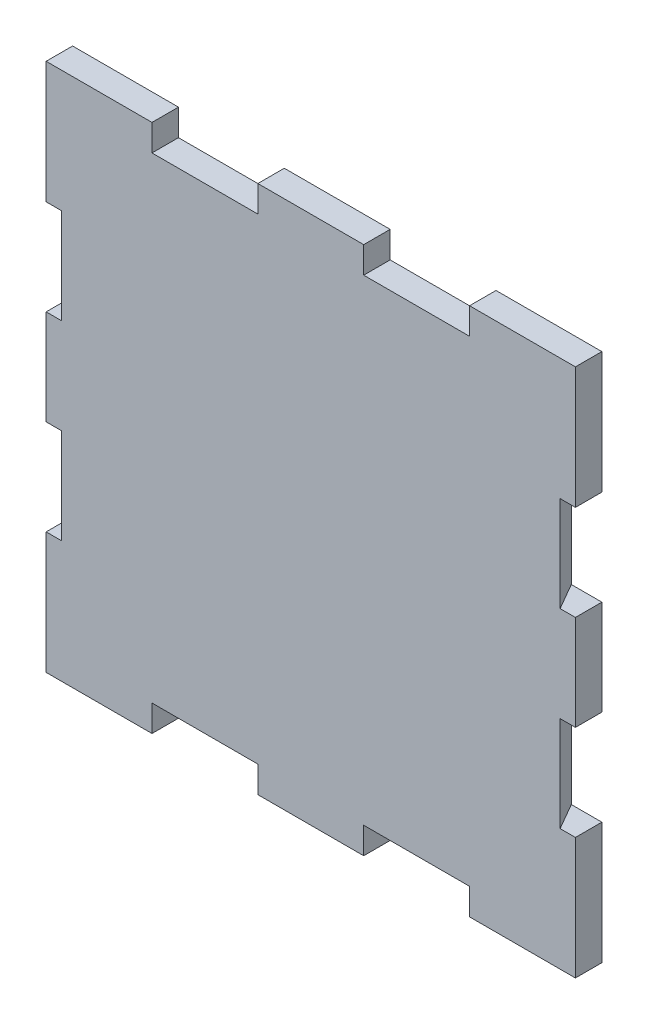
ISO-10303-21;
HEADER;
FILE_DESCRIPTION(('STEP AP214'),'2;1');
FILE_NAME('part.step','',(''),(''),'','','');
FILE_SCHEMA(('AUTOMOTIVE_DESIGN { 1 0 10303 214 1 1 1 1 }'));
ENDSEC;
DATA;
#1=APPLICATION_CONTEXT('core data for automotive mechanical design processes');
#2=APPLICATION_PROTOCOL_DEFINITION('international standard','automotive_design',2000,#1);
#3=PRODUCT_CONTEXT('',#1,'mechanical');
#4=PRODUCT('Part','Part','',(#3));
#5=PRODUCT_RELATED_PRODUCT_CATEGORY('part','',(#4));
#6=PRODUCT_DEFINITION_FORMATION('','',#4);
#7=PRODUCT_DEFINITION_CONTEXT('part definition',#1,'design');
#8=PRODUCT_DEFINITION('design','',#6,#7);
#9=PRODUCT_DEFINITION_SHAPE('','',#8);
#10=(LENGTH_UNIT() NAMED_UNIT(*) SI_UNIT(.MILLI.,.METRE.));
#11=(NAMED_UNIT(*) PLANE_ANGLE_UNIT() SI_UNIT($,.RADIAN.));
#12=(NAMED_UNIT(*) SI_UNIT($,.STERADIAN.) SOLID_ANGLE_UNIT());
#13=UNCERTAINTY_MEASURE_WITH_UNIT(LENGTH_MEASURE(1.E-05),#10,'distance_accuracy_value','');
#14=(GEOMETRIC_REPRESENTATION_CONTEXT(3) GLOBAL_UNCERTAINTY_ASSIGNED_CONTEXT((#13)) GLOBAL_UNIT_ASSIGNED_CONTEXT((#10,
#11,#12)) REPRESENTATION_CONTEXT('',''));
#15=CARTESIAN_POINT('',(0.,0.,0.));
#16=DIRECTION('',(0.,0.,1.));
#17=DIRECTION('',(1.,0.,0.));
#18=AXIS2_PLACEMENT_3D('',#15,#16,#17);
#19=CARTESIAN_POINT('',(0.,0.,0.));
#20=DIRECTION('',(0.,0.,-1.));
#21=DIRECTION('',(-1.,0.,0.));
#22=AXIS2_PLACEMENT_3D('',#19,#20,#21);
#23=PLANE('',#22);
#24=DIRECTION('',(-1.,0.,0.));
#25=VECTOR('',#24,1.);
#26=CARTESIAN_POINT('',(-2.88675134594817,-23.,0.));
#27=LINE('',#26,#25);
#28=CARTESIAN_POINT('',(0.,-23.,0.));
#29=VERTEX_POINT('',#28);
#30=CARTESIAN_POINT('',(-5.77350269189625,-23.,0.));
#31=VERTEX_POINT('',#30);
#32=EDGE_CURVE('E266',#29,#31,#27,.T.);
#33=ORIENTED_EDGE('',*,*,#32,.T.);
#34=DIRECTION('',(0.,1.,0.));
#35=VECTOR('',#34,1.);
#36=CARTESIAN_POINT('',(-5.77350269189625,-46.7735026918962,0.));
#37=LINE('',#36,#35);
#38=CARTESIAN_POINT('',(-5.77350269189625,-41.,0.));
#39=VERTEX_POINT('',#38);
#40=EDGE_CURVE('E269',#39,#31,#37,.T.);
#41=ORIENTED_EDGE('',*,*,#40,.F.);
#42=DIRECTION('',(1.,0.,0.));
#43=VECTOR('',#42,1.);
#44=CARTESIAN_POINT('',(-2.88675134594817,-41.,0.));
#45=LINE('',#44,#43);
#46=CARTESIAN_POINT('',(0.,-41.,0.));
#47=VERTEX_POINT('',#46);
#48=EDGE_CURVE('E275',#39,#47,#45,.T.);
#49=ORIENTED_EDGE('',*,*,#48,.T.);
#50=DIRECTION('',(0.,1.,0.));
#51=VECTOR('',#50,1.);
#52=CARTESIAN_POINT('',(0.,0.,0.));
#53=LINE('',#52,#51);
#54=CARTESIAN_POINT('',(0.,-59.,0.));
#55=VERTEX_POINT('',#54);
#56=EDGE_CURVE('E505',#55,#47,#53,.T.);
#57=ORIENTED_EDGE('',*,*,#56,.F.);
#58=DIRECTION('',(-1.,0.,0.));
#59=VECTOR('',#58,1.);
#60=CARTESIAN_POINT('',(-2.88675134594817,-59.,0.));
#61=LINE('',#60,#59);
#62=CARTESIAN_POINT('',(-5.77350269189625,-59.,0.));
#63=VERTEX_POINT('',#62);
#64=EDGE_CURVE('E335',#55,#63,#61,.T.);
#65=ORIENTED_EDGE('',*,*,#64,.T.);
#66=DIRECTION('',(0.,1.,0.));
#67=VECTOR('',#66,1.);
#68=CARTESIAN_POINT('',(-5.77350269189625,-82.7735026918962,0.));
#69=LINE('',#68,#67);
#70=CARTESIAN_POINT('',(-5.77350269189625,-77.,0.));
#71=VERTEX_POINT('',#70);
#72=EDGE_CURVE('E291',#71,#63,#69,.T.);
#73=ORIENTED_EDGE('',*,*,#72,.F.);
#74=DIRECTION('',(1.,0.,0.));
#75=VECTOR('',#74,1.);
#76=CARTESIAN_POINT('',(-2.88675134594817,-77.,0.));
#77=LINE('',#76,#75);
#78=CARTESIAN_POINT('',(0.,-77.,0.));
#79=VERTEX_POINT('',#78);
#80=EDGE_CURVE('E337',#71,#79,#77,.T.);
#81=ORIENTED_EDGE('',*,*,#80,.T.);
#82=CARTESIAN_POINT('',(0.,-100.,0.));
#83=VERTEX_POINT('',#82);
#84=EDGE_CURVE('E501',#83,#79,#53,.T.);
#85=ORIENTED_EDGE('',*,*,#84,.F.);
#86=DIRECTION('',(1.,0.,0.));
#87=VECTOR('',#86,1.);
#88=CARTESIAN_POINT('',(0.,-100.,0.));
#89=LINE('',#88,#87);
#90=CARTESIAN_POINT('',(-20.,-100.,0.));
#91=VERTEX_POINT('',#90);
#92=EDGE_CURVE('E514',#91,#83,#89,.T.);
#93=ORIENTED_EDGE('',*,*,#92,.F.);
#94=DIRECTION('',(0.,1.,0.));
#95=VECTOR('',#94,1.);
#96=CARTESIAN_POINT('',(-20.,-95.,0.));
#97=LINE('',#96,#95);
#98=CARTESIAN_POINT('',(-20.,-95.,0.));
#99=VERTEX_POINT('',#98);
#100=EDGE_CURVE('E412',#91,#99,#97,.T.);
#101=ORIENTED_EDGE('',*,*,#100,.T.);
#102=DIRECTION('',(-1.,0.,0.));
#103=VECTOR('',#102,1.);
#104=CARTESIAN_POINT('',(-40.,-95.,0.));
#105=LINE('',#104,#103);
#106=CARTESIAN_POINT('',(-40.,-95.,0.));
#107=VERTEX_POINT('',#106);
#108=EDGE_CURVE('E405',#99,#107,#105,.T.);
#109=ORIENTED_EDGE('',*,*,#108,.T.);
#110=DIRECTION('',(0.,-1.,0.));
#111=VECTOR('',#110,1.);
#112=CARTESIAN_POINT('',(-40.,-95.,0.));
#113=LINE('',#112,#111);
#114=CARTESIAN_POINT('',(-40.,-100.,0.));
#115=VERTEX_POINT('',#114);
#116=EDGE_CURVE('E408',#107,#115,#113,.T.);
#117=ORIENTED_EDGE('',*,*,#116,.T.);
#118=CARTESIAN_POINT('',(-60.,-100.,0.));
#119=VERTEX_POINT('',#118);
#120=EDGE_CURVE('E519',#119,#115,#89,.T.);
#121=ORIENTED_EDGE('',*,*,#120,.F.);
#122=DIRECTION('',(0.,1.,0.));
#123=VECTOR('',#122,1.);
#124=CARTESIAN_POINT('',(-60.,-95.,0.));
#125=LINE('',#124,#123);
#126=CARTESIAN_POINT('',(-60.,-95.,0.));
#127=VERTEX_POINT('',#126);
#128=EDGE_CURVE('E438',#119,#127,#125,.T.);
#129=ORIENTED_EDGE('',*,*,#128,.T.);
#130=DIRECTION('',(-1.,0.,0.));
#131=VECTOR('',#130,1.);
#132=CARTESIAN_POINT('',(-80.,-95.,0.));
#133=LINE('',#132,#131);
#134=CARTESIAN_POINT('',(-80.,-95.,0.));
#135=VERTEX_POINT('',#134);
#136=EDGE_CURVE('E431',#127,#135,#133,.T.);
#137=ORIENTED_EDGE('',*,*,#136,.T.);
#138=DIRECTION('',(0.,-1.,0.));
#139=VECTOR('',#138,1.);
#140=CARTESIAN_POINT('',(-80.,-95.,0.));
#141=LINE('',#140,#139);
#142=CARTESIAN_POINT('',(-80.,-100.,0.));
#143=VERTEX_POINT('',#142);
#144=EDGE_CURVE('E434',#135,#143,#141,.T.);
#145=ORIENTED_EDGE('',*,*,#144,.T.);
#146=CARTESIAN_POINT('',(-100.,-100.,0.));
#147=VERTEX_POINT('',#146);
#148=EDGE_CURVE('E516',#147,#143,#89,.T.);
#149=ORIENTED_EDGE('',*,*,#148,.F.);
#150=DIRECTION('',(0.,-1.,0.));
#151=VECTOR('',#150,1.);
#152=CARTESIAN_POINT('',(-100.,0.,0.));
#153=LINE('',#152,#151);
#154=CARTESIAN_POINT('',(-100.,-77.,0.));
#155=VERTEX_POINT('',#154);
#156=EDGE_CURVE('E509',#155,#147,#153,.T.);
#157=ORIENTED_EDGE('',*,*,#156,.F.);
#158=DIRECTION('',(1.,0.,0.));
#159=VECTOR('',#158,1.);
#160=CARTESIAN_POINT('',(-97.1132486540518,-77.,0.));
#161=LINE('',#160,#159);
#162=CARTESIAN_POINT('',(-94.2264973081035,-77.,0.));
#163=VERTEX_POINT('',#162);
#164=EDGE_CURVE('E320',#155,#163,#161,.T.);
#165=ORIENTED_EDGE('',*,*,#164,.T.);
#166=DIRECTION('',(0.,1.,0.));
#167=VECTOR('',#166,1.);
#168=CARTESIAN_POINT('',(-94.2264973081035,-82.7735026918964,0.));
#169=LINE('',#168,#167);
#170=CARTESIAN_POINT('',(-94.2264973081035,-59.,0.));
#171=VERTEX_POINT('',#170);
#172=EDGE_CURVE('E309',#163,#171,#169,.T.);
#173=ORIENTED_EDGE('',*,*,#172,.T.);
#174=DIRECTION('',(-1.,0.,0.));
#175=VECTOR('',#174,1.);
#176=CARTESIAN_POINT('',(-97.1132486540518,-59.,0.));
#177=LINE('',#176,#175);
#178=CARTESIAN_POINT('',(-100.,-59.,0.));
#179=VERTEX_POINT('',#178);
#180=EDGE_CURVE('E318',#171,#179,#177,.T.);
#181=ORIENTED_EDGE('',*,*,#180,.T.);
#182=CARTESIAN_POINT('',(-100.,-41.,0.));
#183=VERTEX_POINT('',#182);
#184=EDGE_CURVE('E515',#183,#179,#153,.T.);
#185=ORIENTED_EDGE('',*,*,#184,.F.);
#186=DIRECTION('',(1.,0.,0.));
#187=VECTOR('',#186,1.);
#188=CARTESIAN_POINT('',(-97.1132486540518,-41.,0.));
#189=LINE('',#188,#187);
#190=CARTESIAN_POINT('',(-94.2264973081035,-41.,0.));
#191=VERTEX_POINT('',#190);
#192=EDGE_CURVE('E364',#183,#191,#189,.T.);
#193=ORIENTED_EDGE('',*,*,#192,.T.);
#194=DIRECTION('',(0.,-1.,0.));
#195=VECTOR('',#194,1.);
#196=CARTESIAN_POINT('',(-94.2264973081035,-17.2264973081036,0.));
#197=LINE('',#196,#195);
#198=CARTESIAN_POINT('',(-94.2264973081035,-23.,0.));
#199=VERTEX_POINT('',#198);
#200=EDGE_CURVE('E300',#199,#191,#197,.T.);
#201=ORIENTED_EDGE('',*,*,#200,.F.);
#202=DIRECTION('',(-1.,0.,0.));
#203=VECTOR('',#202,1.);
#204=CARTESIAN_POINT('',(-97.1132486540518,-23.,0.));
#205=LINE('',#204,#203);
#206=CARTESIAN_POINT('',(-100.,-23.,0.));
#207=VERTEX_POINT('',#206);
#208=EDGE_CURVE('E362',#199,#207,#205,.T.);
#209=ORIENTED_EDGE('',*,*,#208,.T.);
#210=CARTESIAN_POINT('',(-100.,0.,0.));
#211=VERTEX_POINT('',#210);
#212=EDGE_CURVE('E511',#211,#207,#153,.T.);
#213=ORIENTED_EDGE('',*,*,#212,.F.);
#214=DIRECTION('',(-1.,0.,0.));
#215=VECTOR('',#214,1.);
#216=CARTESIAN_POINT('',(0.,0.,0.));
#217=LINE('',#216,#215);
#218=CARTESIAN_POINT('',(-80.,0.,0.));
#219=VERTEX_POINT('',#218);
#220=EDGE_CURVE('E504',#219,#211,#217,.T.);
#221=ORIENTED_EDGE('',*,*,#220,.F.);
#222=DIRECTION('',(0.,-1.,0.));
#223=VECTOR('',#222,1.);
#224=CARTESIAN_POINT('',(-80.,-4.99999999999998,0.));
#225=LINE('',#224,#223);
#226=CARTESIAN_POINT('',(-80.,-4.99999999999998,0.));
#227=VERTEX_POINT('',#226);
#228=EDGE_CURVE('E455',#219,#227,#225,.T.);
#229=ORIENTED_EDGE('',*,*,#228,.T.);
#230=DIRECTION('',(1.,0.,0.));
#231=VECTOR('',#230,1.);
#232=CARTESIAN_POINT('',(-80.,-4.99999999999998,0.));
#233=LINE('',#232,#231);
#234=CARTESIAN_POINT('',(-60.,-4.99999999999998,0.));
#235=VERTEX_POINT('',#234);
#236=EDGE_CURVE('E458',#227,#235,#233,.T.);
#237=ORIENTED_EDGE('',*,*,#236,.T.);
#238=DIRECTION('',(0.,1.,0.));
#239=VECTOR('',#238,1.);
#240=CARTESIAN_POINT('',(-60.,-4.99999999999998,0.));
#241=LINE('',#240,#239);
#242=CARTESIAN_POINT('',(-60.,0.,0.));
#243=VERTEX_POINT('',#242);
#244=EDGE_CURVE('E462',#235,#243,#241,.T.);
#245=ORIENTED_EDGE('',*,*,#244,.T.);
#246=CARTESIAN_POINT('',(-40.,0.,0.));
#247=VERTEX_POINT('',#246);
#248=EDGE_CURVE('E510',#247,#243,#217,.T.);
#249=ORIENTED_EDGE('',*,*,#248,.F.);
#250=DIRECTION('',(0.,-1.,0.));
#251=VECTOR('',#250,1.);
#252=CARTESIAN_POINT('',(-40.,-4.99999999999998,0.));
#253=LINE('',#252,#251);
#254=CARTESIAN_POINT('',(-40.,-4.99999999999998,0.));
#255=VERTEX_POINT('',#254);
#256=EDGE_CURVE('E377',#247,#255,#253,.T.);
#257=ORIENTED_EDGE('',*,*,#256,.T.);
#258=DIRECTION('',(1.,0.,0.));
#259=VECTOR('',#258,1.);
#260=CARTESIAN_POINT('',(-40.,-4.99999999999998,0.));
#261=LINE('',#260,#259);
#262=CARTESIAN_POINT('',(-20.,-4.99999999999998,0.));
#263=VERTEX_POINT('',#262);
#264=EDGE_CURVE('E380',#255,#263,#261,.T.);
#265=ORIENTED_EDGE('',*,*,#264,.T.);
#266=DIRECTION('',(0.,1.,0.));
#267=VECTOR('',#266,1.);
#268=CARTESIAN_POINT('',(-20.,-4.99999999999998,0.));
#269=LINE('',#268,#267);
#270=CARTESIAN_POINT('',(-20.,0.,0.));
#271=VERTEX_POINT('',#270);
#272=EDGE_CURVE('E384',#263,#271,#269,.T.);
#273=ORIENTED_EDGE('',*,*,#272,.T.);
#274=CARTESIAN_POINT('',(0.,0.,0.));
#275=VERTEX_POINT('',#274);
#276=EDGE_CURVE('E506',#275,#271,#217,.T.);
#277=ORIENTED_EDGE('',*,*,#276,.F.);
#278=EDGE_CURVE('E271',#29,#275,#53,.T.);
#279=ORIENTED_EDGE('',*,*,#278,.F.);
#280=EDGE_LOOP('',(#33,#41,#49,#57,#65,#73,#81,#85,#93,#101,#109,#117,#121,#129,#137,#145,#149,
#157,#165,#173,#181,#185,#193,#201,#209,#213,#221,#229,#237,#245,#249,#257,#265,#273,#277,#279));
#281=FACE_BOUND('',#280,.T.);
#282=ADVANCED_FACE('F33',(#281),#23,.T.);
#283=CARTESIAN_POINT('',(0.,0.,5.));
#284=DIRECTION('',(-1.,0.,0.));
#285=DIRECTION('',(0.,0.,1.));
#286=AXIS2_PLACEMENT_3D('',#283,#284,#285);
#287=PLANE('',#286);
#288=DIRECTION('',(0.,1.,0.));
#289=VECTOR('',#288,1.);
#290=CARTESIAN_POINT('',(0.,0.,5.));
#291=LINE('',#290,#289);
#292=CARTESIAN_POINT('',(0.,-23.,5.));
#293=VERTEX_POINT('',#292);
#294=CARTESIAN_POINT('',(0.,0.,5.));
#295=VERTEX_POINT('',#294);
#296=EDGE_CURVE('E485',#293,#295,#291,.T.);
#297=ORIENTED_EDGE('',*,*,#296,.F.);
#298=DIRECTION('',(0.,0.,1.));
#299=VECTOR('',#298,1.);
#300=CARTESIAN_POINT('',(0.,-23.,0.));
#301=LINE('',#300,#299);
#302=EDGE_CURVE('E346',#29,#293,#301,.T.);
#303=ORIENTED_EDGE('',*,*,#302,.F.);
#304=ORIENTED_EDGE('',*,*,#278,.T.);
#305=DIRECTION('',(0.,0.,-1.));
#306=VECTOR('',#305,1.);
#307=CARTESIAN_POINT('',(0.,0.,5.));
#308=LINE('',#307,#306);
#309=EDGE_CURVE('E11',#295,#275,#308,.T.);
#310=ORIENTED_EDGE('',*,*,#309,.F.);
#311=EDGE_LOOP('',(#297,#303,#304,#310));
#312=FACE_BOUND('',#311,.T.);
#313=ADVANCED_FACE('F580',(#312),#287,.F.);
#314=ORIENTED_EDGE('',*,*,#56,.T.);
#315=DIRECTION('',(0.,0.,1.));
#316=VECTOR('',#315,1.);
#317=CARTESIAN_POINT('',(0.,-41.,0.));
#318=LINE('',#317,#316);
#319=CARTESIAN_POINT('',(0.,-41.,5.));
#320=VERTEX_POINT('',#319);
#321=EDGE_CURVE('E354',#47,#320,#318,.T.);
#322=ORIENTED_EDGE('',*,*,#321,.T.);
#323=CARTESIAN_POINT('',(0.,-59.,5.));
#324=VERTEX_POINT('',#323);
#325=EDGE_CURVE('E484',#324,#320,#291,.T.);
#326=ORIENTED_EDGE('',*,*,#325,.F.);
#327=DIRECTION('',(0.,0.,1.));
#328=VECTOR('',#327,1.);
#329=CARTESIAN_POINT('',(0.,-59.,0.));
#330=LINE('',#329,#328);
#331=EDGE_CURVE('E327',#55,#324,#330,.T.);
#332=ORIENTED_EDGE('',*,*,#331,.F.);
#333=EDGE_LOOP('',(#314,#322,#326,#332));
#334=FACE_BOUND('',#333,.T.);
#335=ADVANCED_FACE('F587',(#334),#287,.F.);
#336=CARTESIAN_POINT('',(-100.,0.,5.));
#337=DIRECTION('',(1.,0.,0.));
#338=DIRECTION('',(0.,0.,-1.));
#339=AXIS2_PLACEMENT_3D('',#336,#337,#338);
#340=PLANE('',#339);
#341=DIRECTION('',(0.,-1.,0.));
#342=VECTOR('',#341,1.);
#343=CARTESIAN_POINT('',(-100.,0.,5.));
#344=LINE('',#343,#342);
#345=CARTESIAN_POINT('',(-100.,-77.,5.));
#346=VERTEX_POINT('',#345);
#347=CARTESIAN_POINT('',(-100.,-100.,5.));
#348=VERTEX_POINT('',#347);
#349=EDGE_CURVE('E489',#346,#348,#344,.T.);
#350=ORIENTED_EDGE('',*,*,#349,.F.);
#351=DIRECTION('',(0.,0.,1.));
#352=VECTOR('',#351,1.);
#353=CARTESIAN_POINT('',(-100.,-77.,0.));
#354=LINE('',#353,#352);
#355=EDGE_CURVE('E331',#155,#346,#354,.T.);
#356=ORIENTED_EDGE('',*,*,#355,.F.);
#357=ORIENTED_EDGE('',*,*,#156,.T.);
#358=DIRECTION('',(0.,0.,-1.));
#359=VECTOR('',#358,1.);
#360=CARTESIAN_POINT('',(-100.,-100.,5.));
#361=LINE('',#360,#359);
#362=EDGE_CURVE('E522',#348,#147,#361,.T.);
#363=ORIENTED_EDGE('',*,*,#362,.F.);
#364=EDGE_LOOP('',(#350,#356,#357,#363));
#365=FACE_BOUND('',#364,.T.);
#366=ADVANCED_FACE('F594',(#365),#340,.F.);
#367=ORIENTED_EDGE('',*,*,#184,.T.);
#368=DIRECTION('',(0.,0.,1.));
#369=VECTOR('',#368,1.);
#370=CARTESIAN_POINT('',(-100.,-59.,0.));
#371=LINE('',#370,#369);
#372=CARTESIAN_POINT('',(-100.,-59.,5.));
#373=VERTEX_POINT('',#372);
#374=EDGE_CURVE('E48',#179,#373,#371,.T.);
#375=ORIENTED_EDGE('',*,*,#374,.T.);
#376=CARTESIAN_POINT('',(-100.,-41.,5.));
#377=VERTEX_POINT('',#376);
#378=EDGE_CURVE('E495',#377,#373,#344,.T.);
#379=ORIENTED_EDGE('',*,*,#378,.F.);
#380=DIRECTION('',(0.,0.,1.));
#381=VECTOR('',#380,1.);
#382=CARTESIAN_POINT('',(-100.,-41.,0.));
#383=LINE('',#382,#381);
#384=EDGE_CURVE('E373',#183,#377,#383,.T.);
#385=ORIENTED_EDGE('',*,*,#384,.F.);
#386=EDGE_LOOP('',(#367,#375,#379,#385));
#387=FACE_BOUND('',#386,.T.);
#388=ADVANCED_FACE('F575',(#387),#340,.F.);
#389=CARTESIAN_POINT('',(0.,0.,5.));
#390=DIRECTION('',(0.,-1.,0.));
#391=DIRECTION('',(0.,0.,-1.));
#392=AXIS2_PLACEMENT_3D('',#389,#390,#391);
#393=PLANE('',#392);
#394=DIRECTION('',(-1.,0.,0.));
#395=VECTOR('',#394,1.);
#396=CARTESIAN_POINT('',(0.,0.,5.));
#397=LINE('',#396,#395);
#398=CARTESIAN_POINT('',(-40.,0.,5.));
#399=VERTEX_POINT('',#398);
#400=CARTESIAN_POINT('',(-60.,0.,5.));
#401=VERTEX_POINT('',#400);
#402=EDGE_CURVE('E490',#399,#401,#397,.T.);
#403=ORIENTED_EDGE('',*,*,#402,.F.);
#404=DIRECTION('',(0.,0.,1.));
#405=VECTOR('',#404,1.);
#406=CARTESIAN_POINT('',(-40.,0.,0.));
#407=LINE('',#406,#405);
#408=EDGE_CURVE('E396',#247,#399,#407,.T.);
#409=ORIENTED_EDGE('',*,*,#408,.F.);
#410=ORIENTED_EDGE('',*,*,#248,.T.);
#411=DIRECTION('',(0.,0.,1.));
#412=VECTOR('',#411,1.);
#413=CARTESIAN_POINT('',(-60.,0.,0.));
#414=LINE('',#413,#412);
#415=EDGE_CURVE('E474',#243,#401,#414,.T.);
#416=ORIENTED_EDGE('',*,*,#415,.T.);
#417=EDGE_LOOP('',(#403,#409,#410,#416));
#418=FACE_BOUND('',#417,.T.);
#419=ADVANCED_FACE('F552',(#418),#393,.F.);
#420=CARTESIAN_POINT('',(-80.,0.,5.));
#421=VERTEX_POINT('',#420);
#422=CARTESIAN_POINT('',(-100.,0.,5.));
#423=VERTEX_POINT('',#422);
#424=EDGE_CURVE('E483',#421,#423,#397,.T.);
#425=ORIENTED_EDGE('',*,*,#424,.F.);
#426=DIRECTION('',(0.,0.,1.));
#427=VECTOR('',#426,1.);
#428=CARTESIAN_POINT('',(-80.,0.,0.));
#429=LINE('',#428,#427);
#430=EDGE_CURVE('E472',#219,#421,#429,.T.);
#431=ORIENTED_EDGE('',*,*,#430,.F.);
#432=ORIENTED_EDGE('',*,*,#220,.T.);
#433=DIRECTION('',(0.,0.,-1.));
#434=VECTOR('',#433,1.);
#435=CARTESIAN_POINT('',(-100.,0.,5.));
#436=LINE('',#435,#434);
#437=EDGE_CURVE('E41',#423,#211,#436,.T.);
#438=ORIENTED_EDGE('',*,*,#437,.F.);
#439=EDGE_LOOP('',(#425,#431,#432,#438));
#440=FACE_BOUND('',#439,.T.);
#441=ADVANCED_FACE('F563',(#440),#393,.F.);
#442=CARTESIAN_POINT('',(0.,-100.,5.));
#443=DIRECTION('',(0.,1.,0.));
#444=DIRECTION('',(0.,0.,1.));
#445=AXIS2_PLACEMENT_3D('',#442,#443,#444);
#446=PLANE('',#445);
#447=DIRECTION('',(1.,0.,0.));
#448=VECTOR('',#447,1.);
#449=CARTESIAN_POINT('',(0.,-100.,5.));
#450=LINE('',#449,#448);
#451=CARTESIAN_POINT('',(-60.,-100.,5.));
#452=VERTEX_POINT('',#451);
#453=CARTESIAN_POINT('',(-40.,-100.,5.));
#454=VERTEX_POINT('',#453);
#455=EDGE_CURVE('E500',#452,#454,#450,.T.);
#456=ORIENTED_EDGE('',*,*,#455,.F.);
#457=DIRECTION('',(0.,0.,1.));
#458=VECTOR('',#457,1.);
#459=CARTESIAN_POINT('',(-60.,-100.,0.));
#460=LINE('',#459,#458);
#461=EDGE_CURVE('E449',#119,#452,#460,.T.);
#462=ORIENTED_EDGE('',*,*,#461,.F.);
#463=ORIENTED_EDGE('',*,*,#120,.T.);
#464=DIRECTION('',(0.,0.,1.));
#465=VECTOR('',#464,1.);
#466=CARTESIAN_POINT('',(-40.,-100.,0.));
#467=LINE('',#466,#465);
#468=EDGE_CURVE('E427',#115,#454,#467,.T.);
#469=ORIENTED_EDGE('',*,*,#468,.T.);
#470=EDGE_LOOP('',(#456,#462,#463,#469));
#471=FACE_BOUND('',#470,.T.);
#472=ADVANCED_FACE('F565',(#471),#446,.F.);
#473=CARTESIAN_POINT('',(-20.,-100.,5.));
#474=VERTEX_POINT('',#473);
#475=CARTESIAN_POINT('',(0.,-100.,5.));
#476=VERTEX_POINT('',#475);
#477=EDGE_CURVE('E494',#474,#476,#450,.T.);
#478=ORIENTED_EDGE('',*,*,#477,.F.);
#479=DIRECTION('',(0.,0.,1.));
#480=VECTOR('',#479,1.);
#481=CARTESIAN_POINT('',(-20.,-100.,0.));
#482=LINE('',#481,#480);
#483=EDGE_CURVE('E425',#91,#474,#482,.T.);
#484=ORIENTED_EDGE('',*,*,#483,.F.);
#485=ORIENTED_EDGE('',*,*,#92,.T.);
#486=DIRECTION('',(0.,0.,-1.));
#487=VECTOR('',#486,1.);
#488=CARTESIAN_POINT('',(0.,-100.,5.));
#489=LINE('',#488,#487);
#490=EDGE_CURVE('E499',#476,#83,#489,.T.);
#491=ORIENTED_EDGE('',*,*,#490,.F.);
#492=EDGE_LOOP('',(#478,#484,#485,#491));
#493=FACE_BOUND('',#492,.T.);
#494=ADVANCED_FACE('F571',(#493),#446,.F.);
#495=ORIENTED_EDGE('',*,*,#84,.T.);
#496=DIRECTION('',(0.,0.,1.));
#497=VECTOR('',#496,1.);
#498=CARTESIAN_POINT('',(0.,-77.,0.));
#499=LINE('',#498,#497);
#500=CARTESIAN_POINT('',(0.,-77.,5.));
#501=VERTEX_POINT('',#500);
#502=EDGE_CURVE('E341',#79,#501,#499,.T.);
#503=ORIENTED_EDGE('',*,*,#502,.T.);
#504=EDGE_CURVE('E480',#476,#501,#291,.T.);
#505=ORIENTED_EDGE('',*,*,#504,.F.);
#506=ORIENTED_EDGE('',*,*,#490,.T.);
#507=EDGE_LOOP('',(#495,#503,#505,#506));
#508=FACE_BOUND('',#507,.T.);
#509=ADVANCED_FACE('F35',(#508),#287,.F.);
#510=ORIENTED_EDGE('',*,*,#276,.T.);
#511=DIRECTION('',(0.,0.,1.));
#512=VECTOR('',#511,1.);
#513=CARTESIAN_POINT('',(-20.,0.,0.));
#514=LINE('',#513,#512);
#515=CARTESIAN_POINT('',(-20.,0.,5.));
#516=VERTEX_POINT('',#515);
#517=EDGE_CURVE('E399',#271,#516,#514,.T.);
#518=ORIENTED_EDGE('',*,*,#517,.T.);
#519=EDGE_CURVE('E486',#295,#516,#397,.T.);
#520=ORIENTED_EDGE('',*,*,#519,.F.);
#521=ORIENTED_EDGE('',*,*,#309,.T.);
#522=EDGE_LOOP('',(#510,#518,#520,#521));
#523=FACE_BOUND('',#522,.T.);
#524=ADVANCED_FACE('F566',(#523),#393,.F.);
#525=ORIENTED_EDGE('',*,*,#212,.T.);
#526=DIRECTION('',(0.,0.,1.));
#527=VECTOR('',#526,1.);
#528=CARTESIAN_POINT('',(-100.,-23.,0.));
#529=LINE('',#528,#527);
#530=CARTESIAN_POINT('',(-100.,-23.,5.));
#531=VERTEX_POINT('',#530);
#532=EDGE_CURVE('E56',#207,#531,#529,.T.);
#533=ORIENTED_EDGE('',*,*,#532,.T.);
#534=EDGE_CURVE('E491',#423,#531,#344,.T.);
#535=ORIENTED_EDGE('',*,*,#534,.F.);
#536=ORIENTED_EDGE('',*,*,#437,.T.);
#537=EDGE_LOOP('',(#525,#533,#535,#536));
#538=FACE_BOUND('',#537,.T.);
#539=ADVANCED_FACE('F529',(#538),#340,.F.);
#540=ORIENTED_EDGE('',*,*,#148,.T.);
#541=DIRECTION('',(0.,0.,1.));
#542=VECTOR('',#541,1.);
#543=CARTESIAN_POINT('',(-80.,-100.,0.));
#544=LINE('',#543,#542);
#545=CARTESIAN_POINT('',(-80.,-100.,5.));
#546=VERTEX_POINT('',#545);
#547=EDGE_CURVE('E451',#143,#546,#544,.T.);
#548=ORIENTED_EDGE('',*,*,#547,.T.);
#549=EDGE_CURVE('E496',#348,#546,#450,.T.);
#550=ORIENTED_EDGE('',*,*,#549,.F.);
#551=ORIENTED_EDGE('',*,*,#362,.T.);
#552=EDGE_LOOP('',(#540,#548,#550,#551));
#553=FACE_BOUND('',#552,.T.);
#554=ADVANCED_FACE('F574',(#553),#446,.F.);
#555=CARTESIAN_POINT('',(0.,0.,5.));
#556=DIRECTION('',(0.,0.,-1.));
#557=DIRECTION('',(-1.,0.,0.));
#558=AXIS2_PLACEMENT_3D('',#555,#556,#557);
#559=PLANE('',#558);
#560=DIRECTION('',(0.,-1.,0.));
#561=VECTOR('',#560,1.);
#562=CARTESIAN_POINT('',(-2.88675134594817,-23.,5.));
#563=LINE('',#562,#561);
#564=CARTESIAN_POINT('',(-2.88675134594817,-23.,5.));
#565=VERTEX_POINT('',#564);
#566=CARTESIAN_POINT('',(-2.88675134594817,-41.,5.));
#567=VERTEX_POINT('',#566);
#568=EDGE_CURVE('E356',#565,#567,#563,.T.);
#569=ORIENTED_EDGE('',*,*,#568,.F.);
#570=DIRECTION('',(-1.,0.,0.));
#571=VECTOR('',#570,1.);
#572=CARTESIAN_POINT('',(-2.88675134594817,-23.,5.));
#573=LINE('',#572,#571);
#574=EDGE_CURVE('E288',#293,#565,#573,.T.);
#575=ORIENTED_EDGE('',*,*,#574,.F.);
#576=ORIENTED_EDGE('',*,*,#296,.T.);
#577=ORIENTED_EDGE('',*,*,#519,.T.);
#578=DIRECTION('',(0.,1.,0.));
#579=VECTOR('',#578,1.);
#580=CARTESIAN_POINT('',(-20.,-4.99999999999998,5.));
#581=LINE('',#580,#579);
#582=CARTESIAN_POINT('',(-20.,-4.99999999999998,5.));
#583=VERTEX_POINT('',#582);
#584=EDGE_CURVE('E381',#583,#516,#581,.T.);
#585=ORIENTED_EDGE('',*,*,#584,.F.);
#586=DIRECTION('',(1.,0.,0.));
#587=VECTOR('',#586,1.);
#588=CARTESIAN_POINT('',(-40.,-4.99999999999998,5.));
#589=LINE('',#588,#587);
#590=CARTESIAN_POINT('',(-40.,-4.99999999999998,5.));
#591=VERTEX_POINT('',#590);
#592=EDGE_CURVE('E391',#591,#583,#589,.T.);
#593=ORIENTED_EDGE('',*,*,#592,.F.);
#594=DIRECTION('',(0.,-1.,0.));
#595=VECTOR('',#594,1.);
#596=CARTESIAN_POINT('',(-40.,-4.99999999999998,5.));
#597=LINE('',#596,#595);
#598=EDGE_CURVE('E388',#399,#591,#597,.T.);
#599=ORIENTED_EDGE('',*,*,#598,.F.);
#600=ORIENTED_EDGE('',*,*,#402,.T.);
#601=DIRECTION('',(0.,1.,0.));
#602=VECTOR('',#601,1.);
#603=CARTESIAN_POINT('',(-60.,-4.99999999999998,5.));
#604=LINE('',#603,#602);
#605=CARTESIAN_POINT('',(-60.,-4.99999999999998,5.));
#606=VERTEX_POINT('',#605);
#607=EDGE_CURVE('E459',#606,#401,#604,.T.);
#608=ORIENTED_EDGE('',*,*,#607,.F.);
#609=DIRECTION('',(1.,0.,0.));
#610=VECTOR('',#609,1.);
#611=CARTESIAN_POINT('',(-80.,-4.99999999999998,5.));
#612=LINE('',#611,#610);
#613=CARTESIAN_POINT('',(-80.,-4.99999999999998,5.));
#614=VERTEX_POINT('',#613);
#615=EDGE_CURVE('E468',#614,#606,#612,.T.);
#616=ORIENTED_EDGE('',*,*,#615,.F.);
#617=DIRECTION('',(0.,-1.,0.));
#618=VECTOR('',#617,1.);
#619=CARTESIAN_POINT('',(-80.,-4.99999999999998,5.));
#620=LINE('',#619,#618);
#621=EDGE_CURVE('E398',#421,#614,#620,.T.);
#622=ORIENTED_EDGE('',*,*,#621,.F.);
#623=ORIENTED_EDGE('',*,*,#424,.T.);
#624=ORIENTED_EDGE('',*,*,#534,.T.);
#625=DIRECTION('',(-1.,0.,0.));
#626=VECTOR('',#625,1.);
#627=CARTESIAN_POINT('',(-97.1132486540518,-23.,5.));
#628=LINE('',#627,#626);
#629=CARTESIAN_POINT('',(-97.1132486540518,-23.,5.));
#630=VERTEX_POINT('',#629);
#631=EDGE_CURVE('E369',#630,#531,#628,.T.);
#632=ORIENTED_EDGE('',*,*,#631,.F.);
#633=DIRECTION('',(0.,1.,0.));
#634=VECTOR('',#633,1.);
#635=CARTESIAN_POINT('',(-97.1132486540518,-23.,5.));
#636=LINE('',#635,#634);
#637=CARTESIAN_POINT('',(-97.1132486540518,-41.,5.));
#638=VERTEX_POINT('',#637);
#639=EDGE_CURVE('E333',#638,#630,#636,.T.);
#640=ORIENTED_EDGE('',*,*,#639,.F.);
#641=DIRECTION('',(1.,0.,0.));
#642=VECTOR('',#641,1.);
#643=CARTESIAN_POINT('',(-97.1132486540518,-41.,5.));
#644=LINE('',#643,#642);
#645=EDGE_CURVE('E365',#377,#638,#644,.T.);
#646=ORIENTED_EDGE('',*,*,#645,.F.);
#647=ORIENTED_EDGE('',*,*,#378,.T.);
#648=DIRECTION('',(-1.,0.,0.));
#649=VECTOR('',#648,1.);
#650=CARTESIAN_POINT('',(-97.1132486540518,-59.,5.));
#651=LINE('',#650,#649);
#652=CARTESIAN_POINT('',(-97.1132486540518,-59.,5.));
#653=VERTEX_POINT('',#652);
#654=EDGE_CURVE('E326',#653,#373,#651,.T.);
#655=ORIENTED_EDGE('',*,*,#654,.F.);
#656=DIRECTION('',(0.,1.,0.));
#657=VECTOR('',#656,1.);
#658=CARTESIAN_POINT('',(-97.1132486540518,-59.,5.));
#659=LINE('',#658,#657);
#660=CARTESIAN_POINT('',(-97.1132486540518,-77.,5.));
#661=VERTEX_POINT('',#660);
#662=EDGE_CURVE('E323',#661,#653,#659,.T.);
#663=ORIENTED_EDGE('',*,*,#662,.F.);
#664=DIRECTION('',(1.,0.,0.));
#665=VECTOR('',#664,1.);
#666=CARTESIAN_POINT('',(-97.1132486540518,-77.,5.));
#667=LINE('',#666,#665);
#668=EDGE_CURVE('E321',#346,#661,#667,.T.);
#669=ORIENTED_EDGE('',*,*,#668,.F.);
#670=ORIENTED_EDGE('',*,*,#349,.T.);
#671=ORIENTED_EDGE('',*,*,#549,.T.);
#672=DIRECTION('',(0.,-1.,0.));
#673=VECTOR('',#672,1.);
#674=CARTESIAN_POINT('',(-80.,-95.,5.));
#675=LINE('',#674,#673);
#676=CARTESIAN_POINT('',(-80.,-95.,5.));
#677=VERTEX_POINT('',#676);
#678=EDGE_CURVE('E444',#677,#546,#675,.T.);
#679=ORIENTED_EDGE('',*,*,#678,.F.);
#680=DIRECTION('',(-1.,0.,0.));
#681=VECTOR('',#680,1.);
#682=CARTESIAN_POINT('',(-80.,-95.,5.));
#683=LINE('',#682,#681);
#684=CARTESIAN_POINT('',(-60.,-95.,5.));
#685=VERTEX_POINT('',#684);
#686=EDGE_CURVE('E375',#685,#677,#683,.T.);
#687=ORIENTED_EDGE('',*,*,#686,.F.);
#688=DIRECTION('',(0.,1.,0.));
#689=VECTOR('',#688,1.);
#690=CARTESIAN_POINT('',(-60.,-95.,5.));
#691=LINE('',#690,#689);
#692=EDGE_CURVE('E435',#452,#685,#691,.T.);
#693=ORIENTED_EDGE('',*,*,#692,.F.);
#694=ORIENTED_EDGE('',*,*,#455,.T.);
#695=DIRECTION('',(0.,-1.,0.));
#696=VECTOR('',#695,1.);
#697=CARTESIAN_POINT('',(-40.,-95.,5.));
#698=LINE('',#697,#696);
#699=CARTESIAN_POINT('',(-40.,-95.,5.));
#700=VERTEX_POINT('',#699);
#701=EDGE_CURVE('E419',#700,#454,#698,.T.);
#702=ORIENTED_EDGE('',*,*,#701,.F.);
#703=DIRECTION('',(-1.,0.,0.));
#704=VECTOR('',#703,1.);
#705=CARTESIAN_POINT('',(-40.,-95.,5.));
#706=LINE('',#705,#704);
#707=CARTESIAN_POINT('',(-20.,-95.,5.));
#708=VERTEX_POINT('',#707);
#709=EDGE_CURVE('E416',#708,#700,#706,.T.);
#710=ORIENTED_EDGE('',*,*,#709,.F.);
#711=DIRECTION('',(0.,1.,0.));
#712=VECTOR('',#711,1.);
#713=CARTESIAN_POINT('',(-20.,-95.,5.));
#714=LINE('',#713,#712);
#715=EDGE_CURVE('E409',#474,#708,#714,.T.);
#716=ORIENTED_EDGE('',*,*,#715,.F.);
#717=ORIENTED_EDGE('',*,*,#477,.T.);
#718=ORIENTED_EDGE('',*,*,#504,.T.);
#719=DIRECTION('',(1.,0.,0.));
#720=VECTOR('',#719,1.);
#721=CARTESIAN_POINT('',(-2.88675134594817,-77.,5.));
#722=LINE('',#721,#720);
#723=CARTESIAN_POINT('',(-2.88675134594817,-77.,5.));
#724=VERTEX_POINT('',#723);
#725=EDGE_CURVE('E338',#724,#501,#722,.T.);
#726=ORIENTED_EDGE('',*,*,#725,.F.);
#727=DIRECTION('',(0.,-1.,0.));
#728=VECTOR('',#727,1.);
#729=CARTESIAN_POINT('',(-2.88675134594817,-59.,5.));
#730=LINE('',#729,#728);
#731=CARTESIAN_POINT('',(-2.88675134594817,-59.,5.));
#732=VERTEX_POINT('',#731);
#733=EDGE_CURVE('E345',#732,#724,#730,.T.);
#734=ORIENTED_EDGE('',*,*,#733,.F.);
#735=DIRECTION('',(-1.,0.,0.));
#736=VECTOR('',#735,1.);
#737=CARTESIAN_POINT('',(-2.88675134594817,-59.,5.));
#738=LINE('',#737,#736);
#739=EDGE_CURVE('E342',#324,#732,#738,.T.);
#740=ORIENTED_EDGE('',*,*,#739,.F.);
#741=ORIENTED_EDGE('',*,*,#325,.T.);
#742=DIRECTION('',(1.,0.,0.));
#743=VECTOR('',#742,1.);
#744=CARTESIAN_POINT('',(-2.88675134594817,-41.,5.));
#745=LINE('',#744,#743);
#746=EDGE_CURVE('E276',#567,#320,#745,.T.);
#747=ORIENTED_EDGE('',*,*,#746,.F.);
#748=EDGE_LOOP('',(#569,#575,#576,#577,#585,#593,#599,#600,#608,#616,#622,#623,#624,#632,#640,
#646,#647,#655,#663,#669,#670,#671,#679,#687,#693,#694,#702,#710,#716,#717,#718,#726,#734,#740,
#741,#747));
#749=FACE_BOUND('',#748,.T.);
#750=ADVANCED_FACE('F541',(#749),#559,.F.);
#751=CARTESIAN_POINT('',(-80.,-4.99999999999998,0.));
#752=DIRECTION('',(-1.,0.,0.));
#753=DIRECTION('',(0.,0.,1.));
#754=AXIS2_PLACEMENT_3D('',#751,#752,#753);
#755=PLANE('',#754);
#756=ORIENTED_EDGE('',*,*,#621,.T.);
#757=DIRECTION('',(0.,0.,1.));
#758=VECTOR('',#757,1.);
#759=CARTESIAN_POINT('',(-80.,-4.99999999999998,0.));
#760=LINE('',#759,#758);
#761=EDGE_CURVE('E465',#227,#614,#760,.T.);
#762=ORIENTED_EDGE('',*,*,#761,.F.);
#763=ORIENTED_EDGE('',*,*,#228,.F.);
#764=ORIENTED_EDGE('',*,*,#430,.T.);
#765=EDGE_LOOP('',(#756,#762,#763,#764));
#766=FACE_BOUND('',#765,.T.);
#767=ADVANCED_FACE('F562',(#766),#755,.F.);
#768=CARTESIAN_POINT('',(-60.,-4.99999999999998,0.));
#769=DIRECTION('',(1.,0.,0.));
#770=DIRECTION('',(0.,0.,-1.));
#771=AXIS2_PLACEMENT_3D('',#768,#769,#770);
#772=PLANE('',#771);
#773=ORIENTED_EDGE('',*,*,#607,.T.);
#774=ORIENTED_EDGE('',*,*,#415,.F.);
#775=ORIENTED_EDGE('',*,*,#244,.F.);
#776=DIRECTION('',(0.,0.,1.));
#777=VECTOR('',#776,1.);
#778=CARTESIAN_POINT('',(-60.,-4.99999999999998,0.));
#779=LINE('',#778,#777);
#780=EDGE_CURVE('E477',#235,#606,#779,.T.);
#781=ORIENTED_EDGE('',*,*,#780,.T.);
#782=EDGE_LOOP('',(#773,#774,#775,#781));
#783=FACE_BOUND('',#782,.T.);
#784=ADVANCED_FACE('F556',(#783),#772,.F.);
#785=CARTESIAN_POINT('',(-80.,-4.99999999999998,0.));
#786=DIRECTION('',(0.,-1.,0.));
#787=DIRECTION('',(0.,0.,-1.));
#788=AXIS2_PLACEMENT_3D('',#785,#786,#787);
#789=PLANE('',#788);
#790=ORIENTED_EDGE('',*,*,#615,.T.);
#791=ORIENTED_EDGE('',*,*,#780,.F.);
#792=ORIENTED_EDGE('',*,*,#236,.F.);
#793=ORIENTED_EDGE('',*,*,#761,.T.);
#794=EDGE_LOOP('',(#790,#791,#792,#793));
#795=FACE_BOUND('',#794,.T.);
#796=ADVANCED_FACE('F560',(#795),#789,.F.);
#797=CARTESIAN_POINT('',(-40.,-4.99999999999998,0.));
#798=DIRECTION('',(-1.,0.,0.));
#799=DIRECTION('',(0.,0.,1.));
#800=AXIS2_PLACEMENT_3D('',#797,#798,#799);
#801=PLANE('',#800);
#802=ORIENTED_EDGE('',*,*,#598,.T.);
#803=DIRECTION('',(0.,0.,1.));
#804=VECTOR('',#803,1.);
#805=CARTESIAN_POINT('',(-40.,-4.99999999999998,0.));
#806=LINE('',#805,#804);
#807=EDGE_CURVE('E387',#255,#591,#806,.T.);
#808=ORIENTED_EDGE('',*,*,#807,.F.);
#809=ORIENTED_EDGE('',*,*,#256,.F.);
#810=ORIENTED_EDGE('',*,*,#408,.T.);
#811=EDGE_LOOP('',(#802,#808,#809,#810));
#812=FACE_BOUND('',#811,.T.);
#813=ADVANCED_FACE('F644',(#812),#801,.F.);
#814=CARTESIAN_POINT('',(-20.,-4.99999999999998,0.));
#815=DIRECTION('',(1.,0.,0.));
#816=DIRECTION('',(0.,0.,-1.));
#817=AXIS2_PLACEMENT_3D('',#814,#815,#816);
#818=PLANE('',#817);
#819=ORIENTED_EDGE('',*,*,#584,.T.);
#820=ORIENTED_EDGE('',*,*,#517,.F.);
#821=ORIENTED_EDGE('',*,*,#272,.F.);
#822=DIRECTION('',(0.,0.,1.));
#823=VECTOR('',#822,1.);
#824=CARTESIAN_POINT('',(-20.,-4.99999999999998,0.));
#825=LINE('',#824,#823);
#826=EDGE_CURVE('E402',#263,#583,#825,.T.);
#827=ORIENTED_EDGE('',*,*,#826,.T.);
#828=EDGE_LOOP('',(#819,#820,#821,#827));
#829=FACE_BOUND('',#828,.T.);
#830=ADVANCED_FACE('F640',(#829),#818,.F.);
#831=CARTESIAN_POINT('',(-40.,-4.99999999999998,0.));
#832=DIRECTION('',(0.,-1.,0.));
#833=DIRECTION('',(0.,0.,-1.));
#834=AXIS2_PLACEMENT_3D('',#831,#832,#833);
#835=PLANE('',#834);
#836=ORIENTED_EDGE('',*,*,#592,.T.);
#837=ORIENTED_EDGE('',*,*,#826,.F.);
#838=ORIENTED_EDGE('',*,*,#264,.F.);
#839=ORIENTED_EDGE('',*,*,#807,.T.);
#840=EDGE_LOOP('',(#836,#837,#838,#839));
#841=FACE_BOUND('',#840,.T.);
#842=ADVANCED_FACE('F643',(#841),#835,.F.);
#843=CARTESIAN_POINT('',(-40.,-95.,0.));
#844=DIRECTION('',(0.,1.,0.));
#845=DIRECTION('',(0.,0.,1.));
#846=AXIS2_PLACEMENT_3D('',#843,#844,#845);
#847=PLANE('',#846);
#848=ORIENTED_EDGE('',*,*,#709,.T.);
#849=DIRECTION('',(0.,0.,1.));
#850=VECTOR('',#849,1.);
#851=CARTESIAN_POINT('',(-40.,-95.,0.));
#852=LINE('',#851,#850);
#853=EDGE_CURVE('E415',#107,#700,#852,.T.);
#854=ORIENTED_EDGE('',*,*,#853,.F.);
#855=ORIENTED_EDGE('',*,*,#108,.F.);
#856=DIRECTION('',(0.,0.,1.));
#857=VECTOR('',#856,1.);
#858=CARTESIAN_POINT('',(-20.,-95.,0.));
#859=LINE('',#858,#857);
#860=EDGE_CURVE('E392',#99,#708,#859,.T.);
#861=ORIENTED_EDGE('',*,*,#860,.T.);
#862=EDGE_LOOP('',(#848,#854,#855,#861));
#863=FACE_BOUND('',#862,.T.);
#864=ADVANCED_FACE('F648',(#863),#847,.F.);
#865=CARTESIAN_POINT('',(-20.,-95.,0.));
#866=DIRECTION('',(1.,0.,0.));
#867=DIRECTION('',(0.,0.,-1.));
#868=AXIS2_PLACEMENT_3D('',#865,#866,#867);
#869=PLANE('',#868);
#870=ORIENTED_EDGE('',*,*,#715,.T.);
#871=ORIENTED_EDGE('',*,*,#860,.F.);
#872=ORIENTED_EDGE('',*,*,#100,.F.);
#873=ORIENTED_EDGE('',*,*,#483,.T.);
#874=EDGE_LOOP('',(#870,#871,#872,#873));
#875=FACE_BOUND('',#874,.T.);
#876=ADVANCED_FACE('F653',(#875),#869,.F.);
#877=CARTESIAN_POINT('',(-40.,-95.,0.));
#878=DIRECTION('',(-1.,0.,0.));
#879=DIRECTION('',(0.,0.,1.));
#880=AXIS2_PLACEMENT_3D('',#877,#878,#879);
#881=PLANE('',#880);
#882=ORIENTED_EDGE('',*,*,#701,.T.);
#883=ORIENTED_EDGE('',*,*,#468,.F.);
#884=ORIENTED_EDGE('',*,*,#116,.F.);
#885=ORIENTED_EDGE('',*,*,#853,.T.);
#886=EDGE_LOOP('',(#882,#883,#884,#885));
#887=FACE_BOUND('',#886,.T.);
#888=ADVANCED_FACE('F656',(#887),#881,.F.);
#889=CARTESIAN_POINT('',(-80.,-95.,0.));
#890=DIRECTION('',(0.,1.,0.));
#891=DIRECTION('',(0.,0.,1.));
#892=AXIS2_PLACEMENT_3D('',#889,#890,#891);
#893=PLANE('',#892);
#894=ORIENTED_EDGE('',*,*,#686,.T.);
#895=DIRECTION('',(0.,0.,1.));
#896=VECTOR('',#895,1.);
#897=CARTESIAN_POINT('',(-80.,-95.,0.));
#898=LINE('',#897,#896);
#899=EDGE_CURVE('E441',#135,#677,#898,.T.);
#900=ORIENTED_EDGE('',*,*,#899,.F.);
#901=ORIENTED_EDGE('',*,*,#136,.F.);
#902=DIRECTION('',(0.,0.,1.));
#903=VECTOR('',#902,1.);
#904=CARTESIAN_POINT('',(-60.,-95.,0.));
#905=LINE('',#904,#903);
#906=EDGE_CURVE('E420',#127,#685,#905,.T.);
#907=ORIENTED_EDGE('',*,*,#906,.T.);
#908=EDGE_LOOP('',(#894,#900,#901,#907));
#909=FACE_BOUND('',#908,.T.);
#910=ADVANCED_FACE('F660',(#909),#893,.F.);
#911=CARTESIAN_POINT('',(-60.,-95.,0.));
#912=DIRECTION('',(1.,0.,0.));
#913=DIRECTION('',(0.,0.,-1.));
#914=AXIS2_PLACEMENT_3D('',#911,#912,#913);
#915=PLANE('',#914);
#916=ORIENTED_EDGE('',*,*,#692,.T.);
#917=ORIENTED_EDGE('',*,*,#906,.F.);
#918=ORIENTED_EDGE('',*,*,#128,.F.);
#919=ORIENTED_EDGE('',*,*,#461,.T.);
#920=EDGE_LOOP('',(#916,#917,#918,#919));
#921=FACE_BOUND('',#920,.T.);
#922=ADVANCED_FACE('F635',(#921),#915,.F.);
#923=CARTESIAN_POINT('',(-80.,-95.,0.));
#924=DIRECTION('',(-1.,0.,0.));
#925=DIRECTION('',(0.,0.,1.));
#926=AXIS2_PLACEMENT_3D('',#923,#924,#925);
#927=PLANE('',#926);
#928=ORIENTED_EDGE('',*,*,#678,.T.);
#929=ORIENTED_EDGE('',*,*,#547,.F.);
#930=ORIENTED_EDGE('',*,*,#144,.F.);
#931=ORIENTED_EDGE('',*,*,#899,.T.);
#932=EDGE_LOOP('',(#928,#929,#930,#931));
#933=FACE_BOUND('',#932,.T.);
#934=ADVANCED_FACE('F619',(#933),#927,.F.);
#935=CARTESIAN_POINT('',(-97.1132486540518,-41.,0.));
#936=DIRECTION('',(0.,-1.,0.));
#937=DIRECTION('',(0.,0.,-1.));
#938=AXIS2_PLACEMENT_3D('',#935,#936,#937);
#939=PLANE('',#938);
#940=ORIENTED_EDGE('',*,*,#645,.T.);
#941=DIRECTION('',(0.50000000000003,0.,-0.866025403784421));
#942=VECTOR('',#941,1.);
#943=CARTESIAN_POINT('',(-97.1132486540518,-41.,5.));
#944=LINE('',#943,#942);
#945=EDGE_CURVE('E303',#638,#191,#944,.T.);
#946=ORIENTED_EDGE('',*,*,#945,.T.);
#947=ORIENTED_EDGE('',*,*,#192,.F.);
#948=ORIENTED_EDGE('',*,*,#384,.T.);
#949=EDGE_LOOP('',(#940,#946,#947,#948));
#950=FACE_BOUND('',#949,.T.);
#951=ADVANCED_FACE('F626',(#950),#939,.F.);
#952=CARTESIAN_POINT('',(-97.1132486540518,-23.,0.));
#953=DIRECTION('',(0.,1.,0.));
#954=DIRECTION('',(0.,0.,1.));
#955=AXIS2_PLACEMENT_3D('',#952,#953,#954);
#956=PLANE('',#955);
#957=ORIENTED_EDGE('',*,*,#631,.T.);
#958=ORIENTED_EDGE('',*,*,#532,.F.);
#959=ORIENTED_EDGE('',*,*,#208,.F.);
#960=DIRECTION('',(0.50000000000003,0.,-0.866025403784421));
#961=VECTOR('',#960,1.);
#962=CARTESIAN_POINT('',(-97.1132486540518,-23.,5.));
#963=LINE('',#962,#961);
#964=EDGE_CURVE('E306',#630,#199,#963,.T.);
#965=ORIENTED_EDGE('',*,*,#964,.F.);
#966=EDGE_LOOP('',(#957,#958,#959,#965));
#967=FACE_BOUND('',#966,.T.);
#968=ADVANCED_FACE('F534',(#967),#956,.F.);
#969=CARTESIAN_POINT('',(-97.1132486540518,-77.,0.));
#970=DIRECTION('',(0.,-1.,0.));
#971=DIRECTION('',(0.,0.,-1.));
#972=AXIS2_PLACEMENT_3D('',#969,#970,#971);
#973=PLANE('',#972);
#974=ORIENTED_EDGE('',*,*,#668,.T.);
#975=DIRECTION('',(-0.50000000000003,0.,0.866025403784421));
#976=VECTOR('',#975,1.);
#977=CARTESIAN_POINT('',(-97.1132486540518,-77.,5.));
#978=LINE('',#977,#976);
#979=EDGE_CURVE('E314',#163,#661,#978,.T.);
#980=ORIENTED_EDGE('',*,*,#979,.F.);
#981=ORIENTED_EDGE('',*,*,#164,.F.);
#982=ORIENTED_EDGE('',*,*,#355,.T.);
#983=EDGE_LOOP('',(#974,#980,#981,#982));
#984=FACE_BOUND('',#983,.T.);
#985=ADVANCED_FACE('F633',(#984),#973,.F.);
#986=CARTESIAN_POINT('',(-97.1132486540518,-59.,0.));
#987=DIRECTION('',(0.,1.,0.));
#988=DIRECTION('',(0.,0.,1.));
#989=AXIS2_PLACEMENT_3D('',#986,#987,#988);
#990=PLANE('',#989);
#991=ORIENTED_EDGE('',*,*,#654,.T.);
#992=ORIENTED_EDGE('',*,*,#374,.F.);
#993=ORIENTED_EDGE('',*,*,#180,.F.);
#994=DIRECTION('',(-0.50000000000003,0.,0.866025403784421));
#995=VECTOR('',#994,1.);
#996=CARTESIAN_POINT('',(-97.1132486540518,-59.,5.));
#997=LINE('',#996,#995);
#998=EDGE_CURVE('E312',#171,#653,#997,.T.);
#999=ORIENTED_EDGE('',*,*,#998,.T.);
#1000=EDGE_LOOP('',(#991,#992,#993,#999));
#1001=FACE_BOUND('',#1000,.T.);
#1002=ADVANCED_FACE('F741',(#1001),#990,.F.);
#1003=CARTESIAN_POINT('',(-2.88675134594817,-59.,0.));
#1004=DIRECTION('',(0.,1.,0.));
#1005=DIRECTION('',(0.,0.,1.));
#1006=AXIS2_PLACEMENT_3D('',#1003,#1004,#1005);
#1007=PLANE('',#1006);
#1008=ORIENTED_EDGE('',*,*,#739,.T.);
#1009=DIRECTION('',(-0.499999999999995,0.,-0.866025403784442));
#1010=VECTOR('',#1009,1.);
#1011=CARTESIAN_POINT('',(-2.88675134594817,-59.,5.));
#1012=LINE('',#1011,#1010);
#1013=EDGE_CURVE('E294',#732,#63,#1012,.T.);
#1014=ORIENTED_EDGE('',*,*,#1013,.T.);
#1015=ORIENTED_EDGE('',*,*,#64,.F.);
#1016=ORIENTED_EDGE('',*,*,#331,.T.);
#1017=EDGE_LOOP('',(#1008,#1014,#1015,#1016));
#1018=FACE_BOUND('',#1017,.T.);
#1019=ADVANCED_FACE('F762',(#1018),#1007,.F.);
#1020=CARTESIAN_POINT('',(-2.88675134594817,-77.,0.));
#1021=DIRECTION('',(0.,-1.,0.));
#1022=DIRECTION('',(0.,0.,-1.));
#1023=AXIS2_PLACEMENT_3D('',#1020,#1021,#1022);
#1024=PLANE('',#1023);
#1025=ORIENTED_EDGE('',*,*,#725,.T.);
#1026=ORIENTED_EDGE('',*,*,#502,.F.);
#1027=ORIENTED_EDGE('',*,*,#80,.F.);
#1028=DIRECTION('',(-0.499999999999995,0.,-0.866025403784442));
#1029=VECTOR('',#1028,1.);
#1030=CARTESIAN_POINT('',(-2.88675134594817,-77.,5.));
#1031=LINE('',#1030,#1029);
#1032=EDGE_CURVE('E297',#724,#71,#1031,.T.);
#1033=ORIENTED_EDGE('',*,*,#1032,.F.);
#1034=EDGE_LOOP('',(#1025,#1026,#1027,#1033));
#1035=FACE_BOUND('',#1034,.T.);
#1036=ADVANCED_FACE('F690',(#1035),#1024,.F.);
#1037=CARTESIAN_POINT('',(-2.88675134594817,-23.,0.));
#1038=DIRECTION('',(0.,1.,0.));
#1039=DIRECTION('',(0.,0.,1.));
#1040=AXIS2_PLACEMENT_3D('',#1037,#1038,#1039);
#1041=PLANE('',#1040);
#1042=ORIENTED_EDGE('',*,*,#574,.T.);
#1043=DIRECTION('',(-0.499999999999995,0.,-0.866025403784442));
#1044=VECTOR('',#1043,1.);
#1045=CARTESIAN_POINT('',(-2.88675134594817,-23.,5.));
#1046=LINE('',#1045,#1044);
#1047=EDGE_CURVE('E282',#565,#31,#1046,.T.);
#1048=ORIENTED_EDGE('',*,*,#1047,.T.);
#1049=ORIENTED_EDGE('',*,*,#32,.F.);
#1050=ORIENTED_EDGE('',*,*,#302,.T.);
#1051=EDGE_LOOP('',(#1042,#1048,#1049,#1050));
#1052=FACE_BOUND('',#1051,.T.);
#1053=ADVANCED_FACE('F286',(#1052),#1041,.F.);
#1054=CARTESIAN_POINT('',(-2.88675134594817,-41.,0.));
#1055=DIRECTION('',(0.,-1.,0.));
#1056=DIRECTION('',(0.,0.,-1.));
#1057=AXIS2_PLACEMENT_3D('',#1054,#1055,#1056);
#1058=PLANE('',#1057);
#1059=ORIENTED_EDGE('',*,*,#746,.T.);
#1060=ORIENTED_EDGE('',*,*,#321,.F.);
#1061=ORIENTED_EDGE('',*,*,#48,.F.);
#1062=DIRECTION('',(-0.499999999999995,0.,-0.866025403784442));
#1063=VECTOR('',#1062,1.);
#1064=CARTESIAN_POINT('',(-2.88675134594817,-41.,5.));
#1065=LINE('',#1064,#1063);
#1066=EDGE_CURVE('E284',#567,#39,#1065,.T.);
#1067=ORIENTED_EDGE('',*,*,#1066,.F.);
#1068=EDGE_LOOP('',(#1059,#1060,#1061,#1067));
#1069=FACE_BOUND('',#1068,.T.);
#1070=ADVANCED_FACE('F689',(#1069),#1058,.F.);
#1071=CARTESIAN_POINT('',(-97.1132486540518,-82.7735026918964,5.));
#1072=DIRECTION('',(-0.866025403784421,0.,-0.50000000000003));
#1073=DIRECTION('',(-0.50000000000003,0.,0.866025403784421));
#1074=AXIS2_PLACEMENT_3D('',#1071,#1072,#1073);
#1075=PLANE('',#1074);
#1076=ORIENTED_EDGE('',*,*,#979,.T.);
#1077=ORIENTED_EDGE('',*,*,#662,.T.);
#1078=ORIENTED_EDGE('',*,*,#998,.F.);
#1079=ORIENTED_EDGE('',*,*,#172,.F.);
#1080=EDGE_LOOP('',(#1076,#1077,#1078,#1079));
#1081=FACE_BOUND('',#1080,.T.);
#1082=ADVANCED_FACE('F700',(#1081),#1075,.T.);
#1083=CARTESIAN_POINT('',(-97.1132486540518,-17.2264973081036,5.));
#1084=DIRECTION('',(-0.866025403784421,0.,-0.50000000000003));
#1085=DIRECTION('',(-0.50000000000003,0.,0.866025403784421));
#1086=AXIS2_PLACEMENT_3D('',#1083,#1084,#1085);
#1087=PLANE('',#1086);
#1088=ORIENTED_EDGE('',*,*,#964,.T.);
#1089=ORIENTED_EDGE('',*,*,#200,.T.);
#1090=ORIENTED_EDGE('',*,*,#945,.F.);
#1091=ORIENTED_EDGE('',*,*,#639,.T.);
#1092=EDGE_LOOP('',(#1088,#1089,#1090,#1091));
#1093=FACE_BOUND('',#1092,.T.);
#1094=ADVANCED_FACE('F536',(#1093),#1087,.T.);
#1095=CARTESIAN_POINT('',(-2.88675134594817,-82.7735026918962,5.));
#1096=DIRECTION('',(0.866025403784442,0.,-0.499999999999995));
#1097=DIRECTION('',(-0.499999999999995,0.,-0.866025403784442));
#1098=AXIS2_PLACEMENT_3D('',#1095,#1096,#1097);
#1099=PLANE('',#1098);
#1100=ORIENTED_EDGE('',*,*,#1032,.T.);
#1101=ORIENTED_EDGE('',*,*,#72,.T.);
#1102=ORIENTED_EDGE('',*,*,#1013,.F.);
#1103=ORIENTED_EDGE('',*,*,#733,.T.);
#1104=EDGE_LOOP('',(#1100,#1101,#1102,#1103));
#1105=FACE_BOUND('',#1104,.T.);
#1106=ADVANCED_FACE('F710',(#1105),#1099,.T.);
#1107=CARTESIAN_POINT('',(-2.88675134594817,-46.7735026918962,5.));
#1108=DIRECTION('',(0.866025403784442,0.,-0.499999999999995));
#1109=DIRECTION('',(-0.499999999999995,0.,-0.866025403784442));
#1110=AXIS2_PLACEMENT_3D('',#1107,#1108,#1109);
#1111=PLANE('',#1110);
#1112=ORIENTED_EDGE('',*,*,#1066,.T.);
#1113=ORIENTED_EDGE('',*,*,#40,.T.);
#1114=ORIENTED_EDGE('',*,*,#1047,.F.);
#1115=ORIENTED_EDGE('',*,*,#568,.T.);
#1116=EDGE_LOOP('',(#1112,#1113,#1114,#1115));
#1117=FACE_BOUND('',#1116,.T.);
#1118=ADVANCED_FACE('F280',(#1117),#1111,.T.);
#1119=CLOSED_SHELL('',(#282,#313,#335,#366,#388,#419,#441,#472,#494,#509,#524,#539,#554,#750,
#767,#784,#796,#813,#830,#842,#864,#876,#888,#910,#922,#934,#951,#968,#985,#1002,#1019,#1036,
#1053,#1070,#1082,#1094,#1106,#1118));
#1120=MANIFOLD_SOLID_BREP('B2',#1119);
#1121=ADVANCED_BREP_SHAPE_REPRESENTATION('',(#18,#1120),#14);
#1122=SHAPE_DEFINITION_REPRESENTATION(#9,#1121);
ENDSEC;
END-ISO-10303-21;
